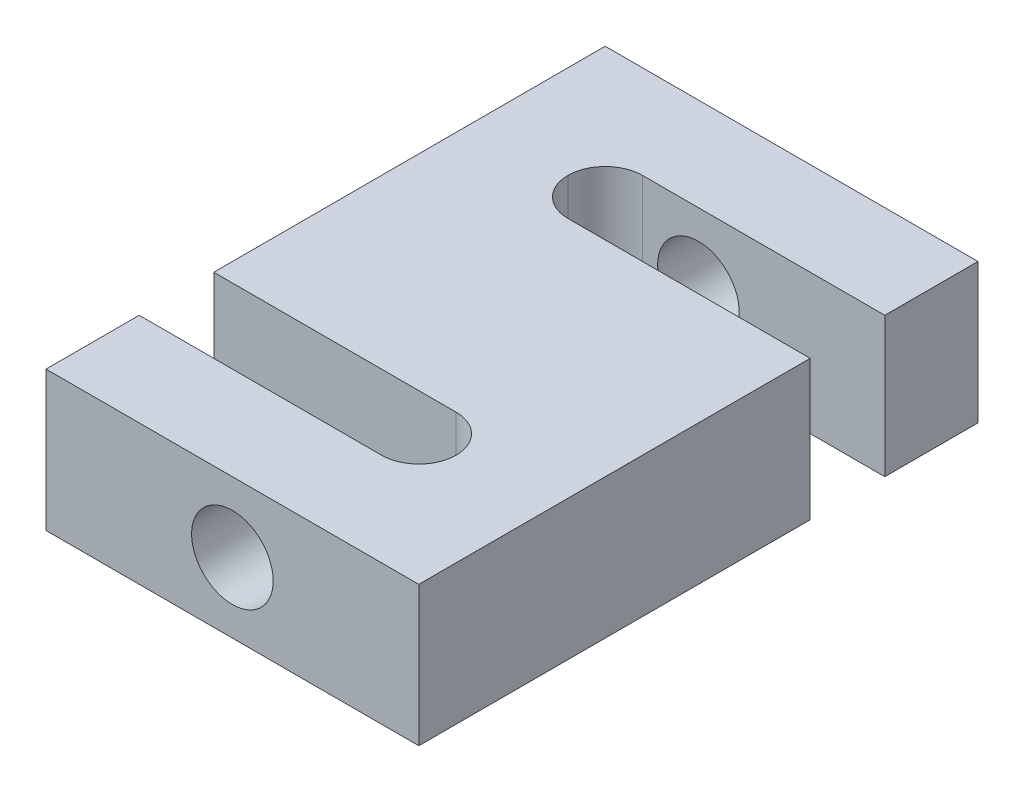
ISO-10303-21;
HEADER;
FILE_DESCRIPTION(('STEP AP214'),'2;1');
FILE_NAME('part.step','',(''),(''),'','','');
FILE_SCHEMA(('AUTOMOTIVE_DESIGN { 1 0 10303 214 1 1 1 1 }'));
ENDSEC;
DATA;
#1=APPLICATION_CONTEXT('core data for automotive mechanical design processes');
#2=APPLICATION_PROTOCOL_DEFINITION('international standard','automotive_design',2000,#1);
#3=PRODUCT_CONTEXT('',#1,'mechanical');
#4=PRODUCT('Part','Part','',(#3));
#5=PRODUCT_RELATED_PRODUCT_CATEGORY('part','',(#4));
#6=PRODUCT_DEFINITION_FORMATION('','',#4);
#7=PRODUCT_DEFINITION_CONTEXT('part definition',#1,'design');
#8=PRODUCT_DEFINITION('design','',#6,#7);
#9=PRODUCT_DEFINITION_SHAPE('','',#8);
#10=(LENGTH_UNIT() NAMED_UNIT(*) SI_UNIT(.MILLI.,.METRE.));
#11=(NAMED_UNIT(*) PLANE_ANGLE_UNIT() SI_UNIT($,.RADIAN.));
#12=(NAMED_UNIT(*) SI_UNIT($,.STERADIAN.) SOLID_ANGLE_UNIT());
#13=UNCERTAINTY_MEASURE_WITH_UNIT(LENGTH_MEASURE(1.E-05),#10,'distance_accuracy_value','');
#14=(GEOMETRIC_REPRESENTATION_CONTEXT(3) GLOBAL_UNCERTAINTY_ASSIGNED_CONTEXT((#13)) GLOBAL_UNIT_ASSIGNED_CONTEXT((#10,
#11,#12)) REPRESENTATION_CONTEXT('',''));
#15=CARTESIAN_POINT('',(0.,0.,0.));
#16=DIRECTION('',(0.,0.,1.));
#17=DIRECTION('',(1.,0.,0.));
#18=AXIS2_PLACEMENT_3D('',#15,#16,#17);
#19=CARTESIAN_POINT('',(0.,19.05,25.4));
#20=DIRECTION('',(0.,0.,1.));
#21=DIRECTION('',(1.,0.,0.));
#22=AXIS2_PLACEMENT_3D('',#19,#20,#21);
#23=PLANE('',#22);
#24=CARTESIAN_POINT('',(0.,9.525,25.4));
#25=DIRECTION('',(0.,0.,1.));
#26=DIRECTION('',(1.,0.,0.));
#27=AXIS2_PLACEMENT_3D('',#24,#25,#26);
#28=CIRCLE('',#27,5.55625);
#29=CARTESIAN_POINT('',(5.55625,9.525,25.4));
#30=VERTEX_POINT('',#29);
#31=EDGE_CURVE('E240',#30,#30,#28,.F.);
#32=ORIENTED_EDGE('',*,*,#31,.F.);
#33=EDGE_LOOP('',(#32));
#34=FACE_BOUND('',#33,.T.);
#35=DIRECTION('',(-1.,0.,0.));
#36=VECTOR('',#35,1.);
#37=CARTESIAN_POINT('',(0.,19.05,25.4));
#38=LINE('',#37,#36);
#39=CARTESIAN_POINT('',(7.62000000000001,19.05,25.4));
#40=VERTEX_POINT('',#39);
#41=CARTESIAN_POINT('',(-25.4,19.05,25.4));
#42=VERTEX_POINT('',#41);
#43=EDGE_CURVE('E137',#40,#42,#38,.T.);
#44=ORIENTED_EDGE('',*,*,#43,.F.);
#45=DIRECTION('',(0.,-1.,0.));
#46=VECTOR('',#45,1.);
#47=CARTESIAN_POINT('',(7.62000000000001,0.,25.4));
#48=LINE('',#47,#46);
#49=CARTESIAN_POINT('',(7.62000000000001,0.,25.4));
#50=VERTEX_POINT('',#49);
#51=EDGE_CURVE('E157',#40,#50,#48,.T.);
#52=ORIENTED_EDGE('',*,*,#51,.T.);
#53=DIRECTION('',(-1.,0.,0.));
#54=VECTOR('',#53,1.);
#55=CARTESIAN_POINT('',(0.,0.,25.4));
#56=LINE('',#55,#54);
#57=CARTESIAN_POINT('',(-25.4,0.,25.4));
#58=VERTEX_POINT('',#57);
#59=EDGE_CURVE('E153',#50,#58,#56,.T.);
#60=ORIENTED_EDGE('',*,*,#59,.T.);
#61=DIRECTION('',(0.,-1.,0.));
#62=VECTOR('',#61,1.);
#63=CARTESIAN_POINT('',(-25.4,19.05,25.4));
#64=LINE('',#63,#62);
#65=EDGE_CURVE('E151',#42,#58,#64,.T.);
#66=ORIENTED_EDGE('',*,*,#65,.F.);
#67=EDGE_LOOP('',(#44,#52,#60,#66));
#68=FACE_BOUND('',#67,.T.);
#69=ADVANCED_FACE('F36',(#34,#68),#23,.F.);
#70=CARTESIAN_POINT('',(-25.4,19.05,0.));
#71=DIRECTION('',(-1.,0.,0.));
#72=DIRECTION('',(0.,0.,1.));
#73=AXIS2_PLACEMENT_3D('',#70,#71,#72);
#74=PLANE('',#73);
#75=DIRECTION('',(0.,0.,-1.));
#76=VECTOR('',#75,1.);
#77=CARTESIAN_POINT('',(-25.4,0.,0.));
#78=LINE('',#77,#76);
#79=CARTESIAN_POINT('',(-25.4,0.,38.1));
#80=VERTEX_POINT('',#79);
#81=EDGE_CURVE('E185',#80,#58,#78,.T.);
#82=ORIENTED_EDGE('',*,*,#81,.F.);
#83=DIRECTION('',(0.,-1.,0.));
#84=VECTOR('',#83,1.);
#85=CARTESIAN_POINT('',(-25.4,19.05,38.1));
#86=LINE('',#85,#84);
#87=CARTESIAN_POINT('',(-25.4,19.05,38.1));
#88=VERTEX_POINT('',#87);
#89=EDGE_CURVE('E158',#88,#80,#86,.T.);
#90=ORIENTED_EDGE('',*,*,#89,.F.);
#91=DIRECTION('',(0.,0.,-1.));
#92=VECTOR('',#91,1.);
#93=CARTESIAN_POINT('',(-25.4,19.05,0.));
#94=LINE('',#93,#92);
#95=EDGE_CURVE('E142',#88,#42,#94,.T.);
#96=ORIENTED_EDGE('',*,*,#95,.T.);
#97=ORIENTED_EDGE('',*,*,#65,.T.);
#98=EDGE_LOOP('',(#82,#90,#96,#97));
#99=FACE_BOUND('',#98,.T.);
#100=ADVANCED_FACE('F160',(#99),#74,.T.);
#101=CARTESIAN_POINT('',(0.,19.05,38.1));
#102=DIRECTION('',(0.,0.,-1.));
#103=DIRECTION('',(-1.,0.,0.));
#104=AXIS2_PLACEMENT_3D('',#101,#102,#103);
#105=PLANE('',#104);
#106=CARTESIAN_POINT('',(0.,9.525,38.1));
#107=DIRECTION('',(0.,0.,1.));
#108=DIRECTION('',(1.,0.,0.));
#109=AXIS2_PLACEMENT_3D('',#106,#107,#108);
#110=CIRCLE('',#109,5.55625);
#111=CARTESIAN_POINT('',(5.55625,9.525,38.1));
#112=VERTEX_POINT('',#111);
#113=EDGE_CURVE('E244',#112,#112,#110,.T.);
#114=ORIENTED_EDGE('',*,*,#113,.F.);
#115=EDGE_LOOP('',(#114));
#116=FACE_BOUND('',#115,.T.);
#117=DIRECTION('',(1.,0.,0.));
#118=VECTOR('',#117,1.);
#119=CARTESIAN_POINT('',(0.,0.,38.1));
#120=LINE('',#119,#118);
#121=CARTESIAN_POINT('',(25.4,0.,38.1));
#122=VERTEX_POINT('',#121);
#123=EDGE_CURVE('E188',#80,#122,#120,.T.);
#124=ORIENTED_EDGE('',*,*,#123,.T.);
#125=DIRECTION('',(0.,-1.,0.));
#126=VECTOR('',#125,1.);
#127=CARTESIAN_POINT('',(25.4,19.05,38.1));
#128=LINE('',#127,#126);
#129=CARTESIAN_POINT('',(25.4,19.05,38.1));
#130=VERTEX_POINT('',#129);
#131=EDGE_CURVE('E214',#130,#122,#128,.T.);
#132=ORIENTED_EDGE('',*,*,#131,.F.);
#133=DIRECTION('',(1.,0.,0.));
#134=VECTOR('',#133,1.);
#135=CARTESIAN_POINT('',(0.,19.05,38.1));
#136=LINE('',#135,#134);
#137=EDGE_CURVE('E162',#88,#130,#136,.T.);
#138=ORIENTED_EDGE('',*,*,#137,.F.);
#139=ORIENTED_EDGE('',*,*,#89,.T.);
#140=EDGE_LOOP('',(#124,#132,#138,#139));
#141=FACE_BOUND('',#140,.T.);
#142=ADVANCED_FACE('F308',(#116,#141),#105,.F.);
#143=CARTESIAN_POINT('',(25.4,19.05,0.));
#144=DIRECTION('',(-1.,0.,0.));
#145=DIRECTION('',(0.,0.,1.));
#146=AXIS2_PLACEMENT_3D('',#143,#144,#145);
#147=PLANE('',#146);
#148=DIRECTION('',(0.,0.,-1.));
#149=VECTOR('',#148,1.);
#150=CARTESIAN_POINT('',(25.4,0.,0.));
#151=LINE('',#150,#149);
#152=CARTESIAN_POINT('',(25.4,0.,-15.24));
#153=VERTEX_POINT('',#152);
#154=EDGE_CURVE('E191',#122,#153,#151,.T.);
#155=ORIENTED_EDGE('',*,*,#154,.T.);
#156=DIRECTION('',(0.,-1.,0.));
#157=VECTOR('',#156,1.);
#158=CARTESIAN_POINT('',(25.4,19.05,-15.24));
#159=LINE('',#158,#157);
#160=CARTESIAN_POINT('',(25.4,19.05,-15.24));
#161=VERTEX_POINT('',#160);
#162=EDGE_CURVE('E211',#161,#153,#159,.T.);
#163=ORIENTED_EDGE('',*,*,#162,.F.);
#164=DIRECTION('',(0.,0.,-1.));
#165=VECTOR('',#164,1.);
#166=CARTESIAN_POINT('',(25.4,19.05,0.));
#167=LINE('',#166,#165);
#168=EDGE_CURVE('E165',#130,#161,#167,.T.);
#169=ORIENTED_EDGE('',*,*,#168,.F.);
#170=ORIENTED_EDGE('',*,*,#131,.T.);
#171=EDGE_LOOP('',(#155,#163,#169,#170));
#172=FACE_BOUND('',#171,.T.);
#173=ADVANCED_FACE('F304',(#172),#147,.F.);
#174=CARTESIAN_POINT('',(0.,19.05,-15.24));
#175=DIRECTION('',(0.,0.,-1.));
#176=DIRECTION('',(-1.,0.,0.));
#177=AXIS2_PLACEMENT_3D('',#174,#175,#176);
#178=PLANE('',#177);
#179=DIRECTION('',(1.,0.,0.));
#180=VECTOR('',#179,1.);
#181=CARTESIAN_POINT('',(0.,0.,-15.24));
#182=LINE('',#181,#180);
#183=CARTESIAN_POINT('',(-7.62,0.,-15.24));
#184=VERTEX_POINT('',#183);
#185=EDGE_CURVE('E194',#184,#153,#182,.T.);
#186=ORIENTED_EDGE('',*,*,#185,.F.);
#187=DIRECTION('',(0.,-1.,0.));
#188=VECTOR('',#187,1.);
#189=CARTESIAN_POINT('',(-7.62,19.05,-15.24));
#190=LINE('',#189,#188);
#191=CARTESIAN_POINT('',(-7.62,19.05,-15.24));
#192=VERTEX_POINT('',#191);
#193=EDGE_CURVE('E221',#184,#192,#190,.F.);
#194=ORIENTED_EDGE('',*,*,#193,.T.);
#195=DIRECTION('',(1.,0.,0.));
#196=VECTOR('',#195,1.);
#197=CARTESIAN_POINT('',(0.,19.05,-15.24));
#198=LINE('',#197,#196);
#199=EDGE_CURVE('E300',#192,#161,#198,.T.);
#200=ORIENTED_EDGE('',*,*,#199,.T.);
#201=ORIENTED_EDGE('',*,*,#162,.T.);
#202=EDGE_LOOP('',(#186,#194,#200,#201));
#203=FACE_BOUND('',#202,.T.);
#204=ADVANCED_FACE('F298',(#203),#178,.T.);
#205=CARTESIAN_POINT('',(0.,19.05,-25.4));
#206=DIRECTION('',(0.,0.,1.));
#207=DIRECTION('',(1.,0.,0.));
#208=AXIS2_PLACEMENT_3D('',#205,#206,#207);
#209=PLANE('',#208);
#210=CARTESIAN_POINT('',(0.,9.525,-25.4));
#211=DIRECTION('',(0.,0.,1.));
#212=DIRECTION('',(1.,0.,0.));
#213=AXIS2_PLACEMENT_3D('',#210,#211,#212);
#214=CIRCLE('',#213,5.55625);
#215=CARTESIAN_POINT('',(-5.55625,9.525,-25.4));
#216=VERTEX_POINT('',#215);
#217=EDGE_CURVE('E254',#216,#216,#214,.F.);
#218=ORIENTED_EDGE('',*,*,#217,.T.);
#219=EDGE_LOOP('',(#218));
#220=FACE_BOUND('',#219,.T.);
#221=DIRECTION('',(-1.,0.,0.));
#222=VECTOR('',#221,1.);
#223=CARTESIAN_POINT('',(0.,19.05,-25.4));
#224=LINE('',#223,#222);
#225=CARTESIAN_POINT('',(25.4,19.05,-25.4));
#226=VERTEX_POINT('',#225);
#227=CARTESIAN_POINT('',(-7.62,19.05,-25.4));
#228=VERTEX_POINT('',#227);
#229=EDGE_CURVE('E179',#226,#228,#224,.T.);
#230=ORIENTED_EDGE('',*,*,#229,.T.);
#231=DIRECTION('',(0.,-1.,0.));
#232=VECTOR('',#231,1.);
#233=CARTESIAN_POINT('',(-7.62,0.,-25.4));
#234=LINE('',#233,#232);
#235=CARTESIAN_POINT('',(-7.62,0.,-25.4));
#236=VERTEX_POINT('',#235);
#237=EDGE_CURVE('E224',#228,#236,#234,.T.);
#238=ORIENTED_EDGE('',*,*,#237,.T.);
#239=DIRECTION('',(-1.,0.,0.));
#240=VECTOR('',#239,1.);
#241=CARTESIAN_POINT('',(0.,0.,-25.4));
#242=LINE('',#241,#240);
#243=CARTESIAN_POINT('',(25.4,0.,-25.4));
#244=VERTEX_POINT('',#243);
#245=EDGE_CURVE('E197',#244,#236,#242,.T.);
#246=ORIENTED_EDGE('',*,*,#245,.F.);
#247=DIRECTION('',(0.,-1.,0.));
#248=VECTOR('',#247,1.);
#249=CARTESIAN_POINT('',(25.4,19.05,-25.4));
#250=LINE('',#249,#248);
#251=EDGE_CURVE('E209',#226,#244,#250,.T.);
#252=ORIENTED_EDGE('',*,*,#251,.F.);
#253=EDGE_LOOP('',(#230,#238,#246,#252));
#254=FACE_BOUND('',#253,.T.);
#255=ADVANCED_FACE('F258',(#220,#254),#209,.T.);
#256=CARTESIAN_POINT('',(25.4,0.,-38.1));
#257=VERTEX_POINT('',#256);
#258=EDGE_CURVE('E195',#244,#257,#151,.T.);
#259=ORIENTED_EDGE('',*,*,#258,.T.);
#260=DIRECTION('',(0.,-1.,0.));
#261=VECTOR('',#260,1.);
#262=CARTESIAN_POINT('',(25.4,19.05,-38.1));
#263=LINE('',#262,#261);
#264=CARTESIAN_POINT('',(25.4,19.05,-38.1));
#265=VERTEX_POINT('',#264);
#266=EDGE_CURVE('E207',#265,#257,#263,.T.);
#267=ORIENTED_EDGE('',*,*,#266,.F.);
#268=EDGE_CURVE('E175',#226,#265,#167,.T.);
#269=ORIENTED_EDGE('',*,*,#268,.F.);
#270=ORIENTED_EDGE('',*,*,#251,.T.);
#271=EDGE_LOOP('',(#259,#267,#269,#270));
#272=FACE_BOUND('',#271,.T.);
#273=ADVANCED_FACE('F271',(#272),#147,.F.);
#274=CARTESIAN_POINT('',(0.,19.05,-38.1));
#275=DIRECTION('',(0.,0.,-1.));
#276=DIRECTION('',(-1.,0.,0.));
#277=AXIS2_PLACEMENT_3D('',#274,#275,#276);
#278=PLANE('',#277);
#279=CARTESIAN_POINT('',(0.,9.525,-38.1));
#280=DIRECTION('',(0.,0.,-1.));
#281=DIRECTION('',(-1.,0.,0.));
#282=AXIS2_PLACEMENT_3D('',#279,#280,#281);
#283=CIRCLE('',#282,5.55625);
#284=CARTESIAN_POINT('',(-5.55625,9.525,-38.1));
#285=VERTEX_POINT('',#284);
#286=EDGE_CURVE('E249',#285,#285,#283,.T.);
#287=ORIENTED_EDGE('',*,*,#286,.F.);
#288=EDGE_LOOP('',(#287));
#289=FACE_BOUND('',#288,.T.);
#290=DIRECTION('',(1.,0.,0.));
#291=VECTOR('',#290,1.);
#292=CARTESIAN_POINT('',(0.,0.,-38.1));
#293=LINE('',#292,#291);
#294=CARTESIAN_POINT('',(-25.4,0.,-38.1));
#295=VERTEX_POINT('',#294);
#296=EDGE_CURVE('E199',#295,#257,#293,.T.);
#297=ORIENTED_EDGE('',*,*,#296,.F.);
#298=DIRECTION('',(0.,-1.,0.));
#299=VECTOR('',#298,1.);
#300=CARTESIAN_POINT('',(-25.4,19.05,-38.1));
#301=LINE('',#300,#299);
#302=CARTESIAN_POINT('',(-25.4,19.05,-38.1));
#303=VERTEX_POINT('',#302);
#304=EDGE_CURVE('E205',#303,#295,#301,.T.);
#305=ORIENTED_EDGE('',*,*,#304,.F.);
#306=DIRECTION('',(1.,0.,0.));
#307=VECTOR('',#306,1.);
#308=CARTESIAN_POINT('',(0.,19.05,-38.1));
#309=LINE('',#308,#307);
#310=EDGE_CURVE('E169',#303,#265,#309,.T.);
#311=ORIENTED_EDGE('',*,*,#310,.T.);
#312=ORIENTED_EDGE('',*,*,#266,.T.);
#313=EDGE_LOOP('',(#297,#305,#311,#312));
#314=FACE_BOUND('',#313,.T.);
#315=ADVANCED_FACE('F268',(#289,#314),#278,.T.);
#316=CARTESIAN_POINT('',(-25.4,0.,15.24));
#317=VERTEX_POINT('',#316);
#318=EDGE_CURVE('E189',#317,#295,#78,.T.);
#319=ORIENTED_EDGE('',*,*,#318,.F.);
#320=DIRECTION('',(0.,-1.,0.));
#321=VECTOR('',#320,1.);
#322=CARTESIAN_POINT('',(-25.4,19.05,15.24));
#323=LINE('',#322,#321);
#324=CARTESIAN_POINT('',(-25.4,19.05,15.24));
#325=VERTEX_POINT('',#324);
#326=EDGE_CURVE('E172',#325,#317,#323,.T.);
#327=ORIENTED_EDGE('',*,*,#326,.F.);
#328=EDGE_CURVE('E164',#325,#303,#94,.T.);
#329=ORIENTED_EDGE('',*,*,#328,.T.);
#330=ORIENTED_EDGE('',*,*,#304,.T.);
#331=EDGE_LOOP('',(#319,#327,#329,#330));
#332=FACE_BOUND('',#331,.T.);
#333=ADVANCED_FACE('F270',(#332),#74,.T.);
#334=CARTESIAN_POINT('',(0.,19.05,15.24));
#335=DIRECTION('',(0.,0.,-1.));
#336=DIRECTION('',(-1.,0.,0.));
#337=AXIS2_PLACEMENT_3D('',#334,#335,#336);
#338=PLANE('',#337);
#339=DIRECTION('',(1.,0.,0.));
#340=VECTOR('',#339,1.);
#341=CARTESIAN_POINT('',(0.,0.,15.24));
#342=LINE('',#341,#340);
#343=CARTESIAN_POINT('',(7.62000000000001,0.,15.24));
#344=VERTEX_POINT('',#343);
#345=EDGE_CURVE('E148',#317,#344,#342,.T.);
#346=ORIENTED_EDGE('',*,*,#345,.T.);
#347=DIRECTION('',(0.,-1.,0.));
#348=VECTOR('',#347,1.);
#349=CARTESIAN_POINT('',(7.62000000000001,19.05,15.24));
#350=LINE('',#349,#348);
#351=CARTESIAN_POINT('',(7.62000000000001,19.05,15.24));
#352=VERTEX_POINT('',#351);
#353=EDGE_CURVE('E219',#344,#352,#350,.F.);
#354=ORIENTED_EDGE('',*,*,#353,.T.);
#355=DIRECTION('',(1.,0.,0.));
#356=VECTOR('',#355,1.);
#357=CARTESIAN_POINT('',(0.,19.05,15.24));
#358=LINE('',#357,#356);
#359=EDGE_CURVE('E168',#325,#352,#358,.T.);
#360=ORIENTED_EDGE('',*,*,#359,.F.);
#361=ORIENTED_EDGE('',*,*,#326,.T.);
#362=EDGE_LOOP('',(#346,#354,#360,#361));
#363=FACE_BOUND('',#362,.T.);
#364=ADVANCED_FACE('F283',(#363),#338,.F.);
#365=CARTESIAN_POINT('',(0.,19.05,0.));
#366=DIRECTION('',(0.,1.,0.));
#367=DIRECTION('',(0.,0.,1.));
#368=AXIS2_PLACEMENT_3D('',#365,#366,#367);
#369=PLANE('',#368);
#370=ORIENTED_EDGE('',*,*,#359,.T.);
#371=CARTESIAN_POINT('',(7.62000000000001,19.05,20.32));
#372=DIRECTION('',(0.,1.,0.));
#373=DIRECTION('',(0.,0.,1.));
#374=AXIS2_PLACEMENT_3D('',#371,#372,#373);
#375=CIRCLE('',#374,5.08);
#376=CARTESIAN_POINT('',(12.7,19.05,20.32));
#377=VERTEX_POINT('',#376);
#378=EDGE_CURVE('E231',#352,#377,#375,.F.);
#379=ORIENTED_EDGE('',*,*,#378,.T.);
#380=CARTESIAN_POINT('',(7.62000000000001,19.05,20.32));
#381=DIRECTION('',(0.,1.,0.));
#382=DIRECTION('',(0.,0.,1.));
#383=AXIS2_PLACEMENT_3D('',#380,#381,#382);
#384=CIRCLE('',#383,5.08);
#385=EDGE_CURVE('E144',#377,#40,#384,.F.);
#386=ORIENTED_EDGE('',*,*,#385,.T.);
#387=ORIENTED_EDGE('',*,*,#43,.T.);
#388=ORIENTED_EDGE('',*,*,#95,.F.);
#389=ORIENTED_EDGE('',*,*,#137,.T.);
#390=ORIENTED_EDGE('',*,*,#168,.T.);
#391=ORIENTED_EDGE('',*,*,#199,.F.);
#392=CARTESIAN_POINT('',(-7.62,19.05,-20.32));
#393=DIRECTION('',(0.,1.,0.));
#394=DIRECTION('',(0.,0.,1.));
#395=AXIS2_PLACEMENT_3D('',#392,#393,#394);
#396=CIRCLE('',#395,5.08);
#397=CARTESIAN_POINT('',(-12.7,19.05,-20.32));
#398=VERTEX_POINT('',#397);
#399=EDGE_CURVE('E52',#192,#398,#396,.F.);
#400=ORIENTED_EDGE('',*,*,#399,.T.);
#401=CARTESIAN_POINT('',(-7.62,19.05,-20.32));
#402=DIRECTION('',(0.,1.,0.));
#403=DIRECTION('',(0.,0.,1.));
#404=AXIS2_PLACEMENT_3D('',#401,#402,#403);
#405=CIRCLE('',#404,5.08);
#406=EDGE_CURVE('E11',#398,#228,#405,.F.);
#407=ORIENTED_EDGE('',*,*,#406,.T.);
#408=ORIENTED_EDGE('',*,*,#229,.F.);
#409=ORIENTED_EDGE('',*,*,#268,.T.);
#410=ORIENTED_EDGE('',*,*,#310,.F.);
#411=ORIENTED_EDGE('',*,*,#328,.F.);
#412=EDGE_LOOP('',(#370,#379,#386,#387,#388,#389,#390,#391,#400,#407,#408,#409,#410,#411));
#413=FACE_BOUND('',#412,.T.);
#414=ADVANCED_FACE('F140',(#413),#369,.T.);
#415=CARTESIAN_POINT('',(0.,0.,0.));
#416=DIRECTION('',(0.,1.,0.));
#417=DIRECTION('',(0.,0.,1.));
#418=AXIS2_PLACEMENT_3D('',#415,#416,#417);
#419=PLANE('',#418);
#420=CARTESIAN_POINT('',(7.62000000000001,0.,20.32));
#421=DIRECTION('',(0.,1.,0.));
#422=DIRECTION('',(0.,0.,1.));
#423=AXIS2_PLACEMENT_3D('',#420,#421,#422);
#424=CIRCLE('',#423,5.08);
#425=CARTESIAN_POINT('',(12.7,0.,20.32));
#426=VERTEX_POINT('',#425);
#427=EDGE_CURVE('E226',#50,#426,#424,.T.);
#428=ORIENTED_EDGE('',*,*,#427,.T.);
#429=CARTESIAN_POINT('',(7.62000000000001,0.,20.32));
#430=DIRECTION('',(0.,1.,0.));
#431=DIRECTION('',(0.,0.,1.));
#432=AXIS2_PLACEMENT_3D('',#429,#430,#431);
#433=CIRCLE('',#432,5.08);
#434=EDGE_CURVE('E229',#426,#344,#433,.T.);
#435=ORIENTED_EDGE('',*,*,#434,.T.);
#436=ORIENTED_EDGE('',*,*,#345,.F.);
#437=ORIENTED_EDGE('',*,*,#318,.T.);
#438=ORIENTED_EDGE('',*,*,#296,.T.);
#439=ORIENTED_EDGE('',*,*,#258,.F.);
#440=ORIENTED_EDGE('',*,*,#245,.T.);
#441=CARTESIAN_POINT('',(-7.62,0.,-20.32));
#442=DIRECTION('',(0.,1.,0.));
#443=DIRECTION('',(0.,0.,1.));
#444=AXIS2_PLACEMENT_3D('',#441,#442,#443);
#445=CIRCLE('',#444,5.08);
#446=CARTESIAN_POINT('',(-12.7,0.,-20.32));
#447=VERTEX_POINT('',#446);
#448=EDGE_CURVE('E45',#236,#447,#445,.T.);
#449=ORIENTED_EDGE('',*,*,#448,.T.);
#450=CARTESIAN_POINT('',(-7.62,0.,-20.32));
#451=DIRECTION('',(0.,1.,0.));
#452=DIRECTION('',(0.,0.,1.));
#453=AXIS2_PLACEMENT_3D('',#450,#451,#452);
#454=CIRCLE('',#453,5.08);
#455=EDGE_CURVE('E233',#447,#184,#454,.T.);
#456=ORIENTED_EDGE('',*,*,#455,.T.);
#457=ORIENTED_EDGE('',*,*,#185,.T.);
#458=ORIENTED_EDGE('',*,*,#154,.F.);
#459=ORIENTED_EDGE('',*,*,#123,.F.);
#460=ORIENTED_EDGE('',*,*,#81,.T.);
#461=ORIENTED_EDGE('',*,*,#59,.F.);
#462=EDGE_LOOP('',(#428,#435,#436,#437,#438,#439,#440,#449,#456,#457,#458,#459,#460,#461));
#463=FACE_BOUND('',#462,.T.);
#464=ADVANCED_FACE('F280',(#463),#419,.F.);
#465=CARTESIAN_POINT('',(7.62000000000001,19.05,20.32));
#466=DIRECTION('',(0.,1.,0.));
#467=DIRECTION('',(0.,0.,1.));
#468=AXIS2_PLACEMENT_3D('',#465,#466,#467);
#469=CYLINDRICAL_SURFACE('',#468,5.08);
#470=DIRECTION('',(0.,-1.,0.));
#471=VECTOR('',#470,1.);
#472=CARTESIAN_POINT('',(12.7,0.,20.32));
#473=LINE('',#472,#471);
#474=EDGE_CURVE('E186',#377,#426,#473,.T.);
#475=ORIENTED_EDGE('',*,*,#474,.F.);
#476=ORIENTED_EDGE('',*,*,#378,.F.);
#477=ORIENTED_EDGE('',*,*,#353,.F.);
#478=ORIENTED_EDGE('',*,*,#434,.F.);
#479=EDGE_LOOP('',(#475,#476,#477,#478));
#480=FACE_BOUND('',#479,.T.);
#481=ADVANCED_FACE('F329',(#480),#469,.F.);
#482=CARTESIAN_POINT('',(7.62000000000001,19.05,20.32));
#483=DIRECTION('',(0.,1.,0.));
#484=DIRECTION('',(0.,0.,1.));
#485=AXIS2_PLACEMENT_3D('',#482,#483,#484);
#486=CYLINDRICAL_SURFACE('',#485,5.08);
#487=ORIENTED_EDGE('',*,*,#385,.F.);
#488=ORIENTED_EDGE('',*,*,#474,.T.);
#489=ORIENTED_EDGE('',*,*,#427,.F.);
#490=ORIENTED_EDGE('',*,*,#51,.F.);
#491=EDGE_LOOP('',(#487,#488,#489,#490));
#492=FACE_BOUND('',#491,.T.);
#493=ADVANCED_FACE('F326',(#492),#486,.F.);
#494=CARTESIAN_POINT('',(-7.62,19.05,-20.32));
#495=DIRECTION('',(0.,1.,0.));
#496=DIRECTION('',(0.,0.,1.));
#497=AXIS2_PLACEMENT_3D('',#494,#495,#496);
#498=CYLINDRICAL_SURFACE('',#497,5.08);
#499=ORIENTED_EDGE('',*,*,#237,.F.);
#500=ORIENTED_EDGE('',*,*,#406,.F.);
#501=DIRECTION('',(0.,-1.,0.));
#502=VECTOR('',#501,1.);
#503=CARTESIAN_POINT('',(-12.7,19.05,-20.32));
#504=LINE('',#503,#502);
#505=EDGE_CURVE('E40',#447,#398,#504,.F.);
#506=ORIENTED_EDGE('',*,*,#505,.F.);
#507=ORIENTED_EDGE('',*,*,#448,.F.);
#508=EDGE_LOOP('',(#499,#500,#506,#507));
#509=FACE_BOUND('',#508,.T.);
#510=ADVANCED_FACE('F38',(#509),#498,.F.);
#511=CARTESIAN_POINT('',(-7.62,19.05,-20.32));
#512=DIRECTION('',(0.,1.,0.));
#513=DIRECTION('',(0.,0.,1.));
#514=AXIS2_PLACEMENT_3D('',#511,#512,#513);
#515=CYLINDRICAL_SURFACE('',#514,5.08);
#516=ORIENTED_EDGE('',*,*,#399,.F.);
#517=ORIENTED_EDGE('',*,*,#193,.F.);
#518=ORIENTED_EDGE('',*,*,#455,.F.);
#519=ORIENTED_EDGE('',*,*,#505,.T.);
#520=EDGE_LOOP('',(#516,#517,#518,#519));
#521=FACE_BOUND('',#520,.T.);
#522=ADVANCED_FACE('F294',(#521),#515,.F.);
#523=CARTESIAN_POINT('',(0.,9.525,-38.101));
#524=DIRECTION('',(0.,0.,1.));
#525=DIRECTION('',(1.,0.,0.));
#526=AXIS2_PLACEMENT_3D('',#523,#524,#525);
#527=CYLINDRICAL_SURFACE('',#526,5.55625);
#528=ORIENTED_EDGE('',*,*,#113,.T.);
#529=EDGE_LOOP('',(#528));
#530=FACE_BOUND('',#529,.T.);
#531=ORIENTED_EDGE('',*,*,#31,.T.);
#532=EDGE_LOOP('',(#531));
#533=FACE_BOUND('',#532,.T.);
#534=ADVANCED_FACE('F264',(#530,#533),#527,.F.);
#535=CARTESIAN_POINT('',(0.,9.525,38.101));
#536=DIRECTION('',(0.,0.,-1.));
#537=DIRECTION('',(-1.,0.,0.));
#538=AXIS2_PLACEMENT_3D('',#535,#536,#537);
#539=CYLINDRICAL_SURFACE('',#538,5.55625);
#540=CARTESIAN_POINT('',(-5.55625,9.525,-25.4));
#541=CARTESIAN_POINT('',(-5.55625,9.525,-25.5322916666667));
#542=CARTESIAN_POINT('',(-5.55625,9.525,-25.6645833333333));
#543=CARTESIAN_POINT('',(-5.55625,9.525,-25.9291666666667));
#544=CARTESIAN_POINT('',(-5.55625,9.525,-26.0614583333333));
#545=CARTESIAN_POINT('',(-5.55625,9.525,-26.3260416666667));
#546=CARTESIAN_POINT('',(-5.55625,9.525,-26.4583333333333));
#547=CARTESIAN_POINT('',(-5.55625,9.525,-26.7229166666667));
#548=CARTESIAN_POINT('',(-5.55625,9.525,-26.8552083333333));
#549=CARTESIAN_POINT('',(-5.55625,9.525,-27.1197916666667));
#550=CARTESIAN_POINT('',(-5.55625,9.525,-27.2520833333333));
#551=CARTESIAN_POINT('',(-5.55625,9.525,-27.5166666666667));
#552=CARTESIAN_POINT('',(-5.55625,9.525,-27.6489583333333));
#553=CARTESIAN_POINT('',(-5.55625,9.525,-27.9135416666667));
#554=CARTESIAN_POINT('',(-5.55625,9.525,-28.0458333333333));
#555=CARTESIAN_POINT('',(-5.55625,9.525,-28.3104166666667));
#556=CARTESIAN_POINT('',(-5.55625,9.525,-28.4427083333333));
#557=CARTESIAN_POINT('',(-5.55625,9.525,-28.7072916666667));
#558=CARTESIAN_POINT('',(-5.55625,9.525,-28.8395833333333));
#559=CARTESIAN_POINT('',(-5.55625,9.525,-29.1041666666667));
#560=CARTESIAN_POINT('',(-5.55625,9.525,-29.2364583333333));
#561=CARTESIAN_POINT('',(-5.55625,9.525,-29.5010416666667));
#562=CARTESIAN_POINT('',(-5.55625,9.525,-29.6333333333333));
#563=CARTESIAN_POINT('',(-5.55625,9.525,-29.8979166666667));
#564=CARTESIAN_POINT('',(-5.55625,9.525,-30.0302083333333));
#565=CARTESIAN_POINT('',(-5.55625,9.525,-30.2947916666667));
#566=CARTESIAN_POINT('',(-5.55625,9.525,-30.4270833333333));
#567=CARTESIAN_POINT('',(-5.55625,9.525,-30.6916666666667));
#568=CARTESIAN_POINT('',(-5.55625,9.525,-30.8239583333333));
#569=CARTESIAN_POINT('',(-5.55625,9.525,-31.0885416666667));
#570=CARTESIAN_POINT('',(-5.55625,9.525,-31.2208333333333));
#571=CARTESIAN_POINT('',(-5.55625,9.525,-31.4854166666667));
#572=CARTESIAN_POINT('',(-5.55625,9.525,-31.6177083333333));
#573=CARTESIAN_POINT('',(-5.55625,9.525,-31.8822916666667));
#574=CARTESIAN_POINT('',(-5.55625,9.525,-32.0145833333333));
#575=CARTESIAN_POINT('',(-5.55625,9.525,-32.2791666666667));
#576=CARTESIAN_POINT('',(-5.55625,9.525,-32.4114583333333));
#577=CARTESIAN_POINT('',(-5.55625,9.525,-32.6760416666667));
#578=CARTESIAN_POINT('',(-5.55625,9.525,-32.8083333333333));
#579=CARTESIAN_POINT('',(-5.55625,9.525,-33.0729166666667));
#580=CARTESIAN_POINT('',(-5.55625,9.525,-33.2052083333333));
#581=CARTESIAN_POINT('',(-5.55625,9.525,-33.4697916666667));
#582=CARTESIAN_POINT('',(-5.55625,9.525,-33.6020833333333));
#583=CARTESIAN_POINT('',(-5.55625,9.525,-33.8666666666667));
#584=CARTESIAN_POINT('',(-5.55625,9.525,-33.9989583333333));
#585=CARTESIAN_POINT('',(-5.55625,9.525,-34.2635416666667));
#586=CARTESIAN_POINT('',(-5.55625,9.525,-34.3958333333333));
#587=CARTESIAN_POINT('',(-5.55625,9.525,-34.6604166666666));
#588=CARTESIAN_POINT('',(-5.55625,9.525,-34.7927083333333));
#589=CARTESIAN_POINT('',(-5.55625,9.525,-35.0572916666667));
#590=CARTESIAN_POINT('',(-5.55625,9.525,-35.1895833333333));
#591=CARTESIAN_POINT('',(-5.55625,9.525,-35.4541666666667));
#592=CARTESIAN_POINT('',(-5.55625,9.525,-35.5864583333333));
#593=CARTESIAN_POINT('',(-5.55625,9.525,-35.8510416666667));
#594=CARTESIAN_POINT('',(-5.55625,9.525,-35.9833333333333));
#595=CARTESIAN_POINT('',(-5.55625,9.525,-36.2479166666667));
#596=CARTESIAN_POINT('',(-5.55625,9.525,-36.3802083333333));
#597=CARTESIAN_POINT('',(-5.55625,9.525,-36.6447916666667));
#598=CARTESIAN_POINT('',(-5.55625,9.525,-36.7770833333333));
#599=CARTESIAN_POINT('',(-5.55625,9.525,-37.0416666666667));
#600=CARTESIAN_POINT('',(-5.55625,9.525,-37.1739583333333));
#601=CARTESIAN_POINT('',(-5.55625,9.525,-37.4385416666667));
#602=CARTESIAN_POINT('',(-5.55625,9.525,-37.5708333333333));
#603=CARTESIAN_POINT('',(-5.55625,9.525,-37.8354166666666));
#604=CARTESIAN_POINT('',(-5.55625,9.525,-37.9677083333333));
#605=CARTESIAN_POINT('',(-5.55625,9.525,-38.1));
#606=B_SPLINE_CURVE_WITH_KNOTS('',3,(#540,#541,#542,#543,#544,#545,#546,#547,#548,#549,#550,
#551,#552,#553,#554,#555,#556,#557,#558,#559,#560,#561,#562,#563,#564,#565,#566,#567,#568,#569,
#570,#571,#572,#573,#574,#575,#576,#577,#578,#579,#580,#581,#582,#583,#584,#585,#586,#587,#588,
#589,#590,#591,#592,#593,#594,#595,#596,#597,#598,#599,#600,#601,#602,#603,#604,#605),
.UNSPECIFIED.,.F.,.F.,(4,2,2,2,2,2,2,2,2,2,2,2,2,2,2,2,2,2,2,2,2,2,2,2,2,2,2,2,2,2,2,2,4),(0.,
0.396875000000005,0.793749999999996,1.190625,1.58749999999999,1.984375,2.38125,2.77812499999999,
3.175,3.571875,3.96874999999999,4.365625,4.7625,5.15937499999999,5.55625,5.95312499999999,
6.34999999999999,6.746875,7.14374999999999,7.540625,7.93749999999999,8.33437499999999,8.73125,
9.12812499999999,9.52499999999999,9.921875,10.31875,10.715625,11.1125,11.509375,11.90625,
12.303125,12.7),.UNSPECIFIED.);
#607=EDGE_CURVE('BSEAM261',#216,#285,#606,.T.);
#608=ORIENTED_EDGE('',*,*,#217,.F.);
#609=ORIENTED_EDGE('',*,*,#286,.T.);
#610=ORIENTED_EDGE('',*,*,#607,.T.);
#611=ORIENTED_EDGE('',*,*,#607,.F.);
#612=EDGE_LOOP('',(#608,#610,#609,#611));
#613=FACE_BOUND('',#612,.T.);
#614=ADVANCED_FACE('F261',(#613),#539,.F.);
#615=CLOSED_SHELL('',(#69,#100,#142,#173,#204,#255,#273,#315,#333,#364,#414,#464,#481,#493,#510,
#522,#534,#614));
#616=MANIFOLD_SOLID_BREP('B2',#615);
#617=ADVANCED_BREP_SHAPE_REPRESENTATION('',(#18,#616),#14);
#618=SHAPE_DEFINITION_REPRESENTATION(#9,#617);
ENDSEC;
END-ISO-10303-21;
